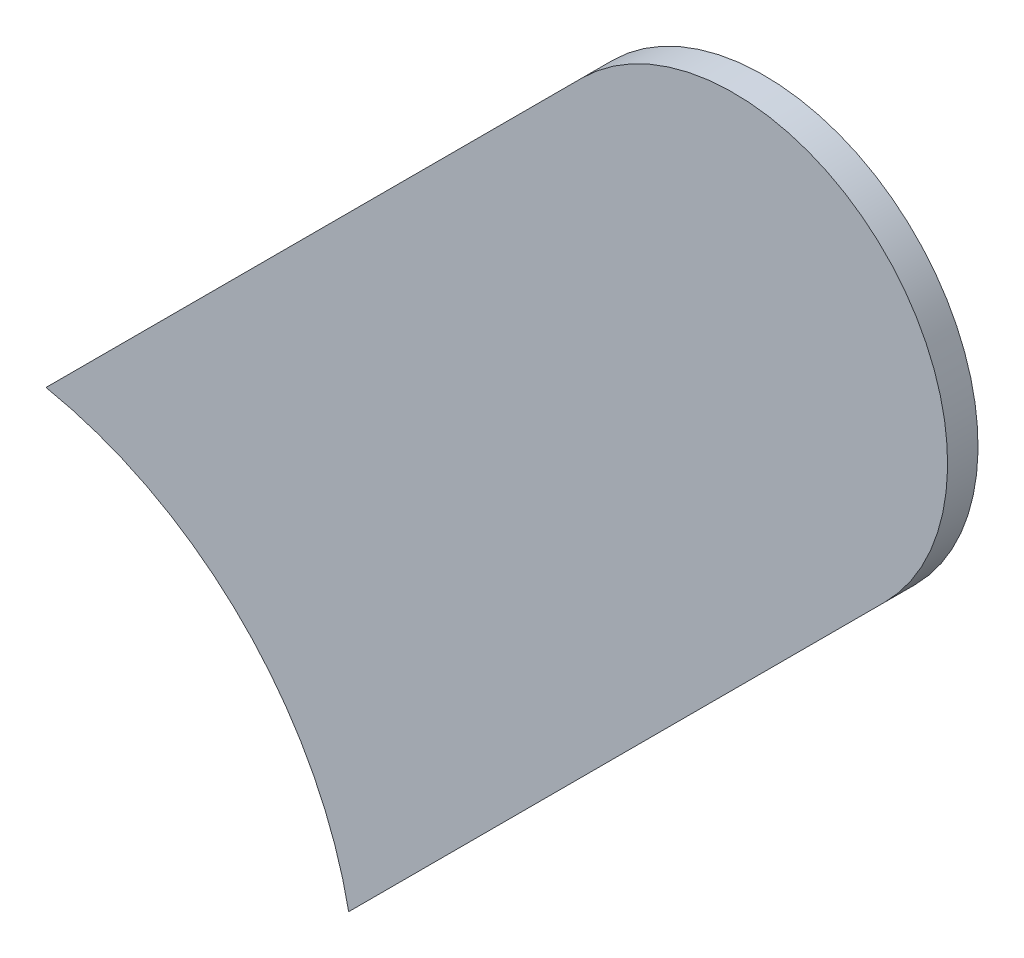
ISO-10303-21;
HEADER;
FILE_DESCRIPTION(('STEP AP214'),'2;1');
FILE_NAME('part.step','',(''),(''),'','','');
FILE_SCHEMA(('AUTOMOTIVE_DESIGN { 1 0 10303 214 1 1 1 1 }'));
ENDSEC;
DATA;
#1=APPLICATION_CONTEXT('core data for automotive mechanical design processes');
#2=APPLICATION_PROTOCOL_DEFINITION('international standard','automotive_design',2000,#1);
#3=PRODUCT_CONTEXT('',#1,'mechanical');
#4=PRODUCT('Part','Part','',(#3));
#5=PRODUCT_RELATED_PRODUCT_CATEGORY('part','',(#4));
#6=PRODUCT_DEFINITION_FORMATION('','',#4);
#7=PRODUCT_DEFINITION_CONTEXT('part definition',#1,'design');
#8=PRODUCT_DEFINITION('design','',#6,#7);
#9=PRODUCT_DEFINITION_SHAPE('','',#8);
#10=(LENGTH_UNIT() NAMED_UNIT(*) SI_UNIT(.MILLI.,.METRE.));
#11=(NAMED_UNIT(*) PLANE_ANGLE_UNIT() SI_UNIT($,.RADIAN.));
#12=(NAMED_UNIT(*) SI_UNIT($,.STERADIAN.) SOLID_ANGLE_UNIT());
#13=UNCERTAINTY_MEASURE_WITH_UNIT(LENGTH_MEASURE(1.E-05),#10,'distance_accuracy_value','');
#14=(GEOMETRIC_REPRESENTATION_CONTEXT(3) GLOBAL_UNCERTAINTY_ASSIGNED_CONTEXT((#13)) GLOBAL_UNIT_ASSIGNED_CONTEXT((#10,
#11,#12)) REPRESENTATION_CONTEXT('',''));
#15=CARTESIAN_POINT('',(0.,0.,0.));
#16=DIRECTION('',(0.,0.,1.));
#17=DIRECTION('',(1.,0.,0.));
#18=AXIS2_PLACEMENT_3D('',#15,#16,#17);
#19=CARTESIAN_POINT('',(90.8413733563948,90.5877949963948,0.));
#20=DIRECTION('',(-0.707106781186553,0.707106781186542,0.));
#21=DIRECTION('',(0.707106781186542,0.707106781186553,0.));
#22=AXIS2_PLACEMENT_3D('',#19,#20,#21);
#23=PLANE('',#22);
#24=DIRECTION('',(0.707106781186542,0.707106781186553,0.));
#25=VECTOR('',#24,1.);
#26=CARTESIAN_POINT('',(90.57679878,90.32322042,0.03556));
#27=LINE('',#26,#25);
#28=CARTESIAN_POINT('',(90.8413733563948,90.5877949963948,0.03556));
#29=VERTEX_POINT('',#28);
#30=CARTESIAN_POINT('',(91.46777998,91.21420162,0.03556));
#31=VERTEX_POINT('',#30);
#32=EDGE_CURVE('E11',#29,#31,#27,.T.);
#33=ORIENTED_EDGE('',*,*,#32,.F.);
#34=DIRECTION('',(0.,0.,1.));
#35=VECTOR('',#34,1.);
#36=CARTESIAN_POINT('',(90.8413733563948,90.5877949963948,0.));
#37=LINE('',#36,#35);
#38=CARTESIAN_POINT('',(90.8413733563948,90.5877949963948,0.));
#39=VERTEX_POINT('',#38);
#40=EDGE_CURVE('E24',#39,#29,#37,.T.);
#41=ORIENTED_EDGE('',*,*,#40,.F.);
#42=DIRECTION('',(0.707106781186542,0.707106781186553,0.));
#43=VECTOR('',#42,1.);
#44=CARTESIAN_POINT('',(90.57679878,90.32322042,0.));
#45=LINE('',#44,#43);
#46=CARTESIAN_POINT('',(91.46777998,91.21420162,0.));
#47=VERTEX_POINT('',#46);
#48=EDGE_CURVE('E75',#39,#47,#45,.T.);
#49=ORIENTED_EDGE('',*,*,#48,.T.);
#50=DIRECTION('',(0.,0.,1.));
#51=VECTOR('',#50,1.);
#52=CARTESIAN_POINT('',(91.46777998,91.21420162,0.));
#53=LINE('',#52,#51);
#54=EDGE_CURVE('E37',#47,#31,#53,.T.);
#55=ORIENTED_EDGE('',*,*,#54,.T.);
#56=EDGE_LOOP('',(#33,#41,#49,#55));
#57=FACE_BOUND('',#56,.T.);
#58=ADVANCED_FACE('F17',(#57),#23,.F.);
#59=CARTESIAN_POINT('',(91.2910036,91.390978,0.));
#60=DIRECTION('',(0.,0.,-1.));
#61=DIRECTION('',(0.707106781186548,-0.707106781186548,0.));
#62=AXIS2_PLACEMENT_3D('',#59,#60,#61);
#63=CYLINDRICAL_SURFACE('',#62,0.249999554103216);
#64=CARTESIAN_POINT('',(91.2910036,91.390978,0.03556));
#65=DIRECTION('',(0.,0.,1.));
#66=DIRECTION('',(0.707106781186548,-0.707106781186548,0.));
#67=AXIS2_PLACEMENT_3D('',#64,#65,#66);
#68=CIRCLE('',#67,0.249999554103216);
#69=CARTESIAN_POINT('',(91.11422722,91.56775438,0.03556));
#70=VERTEX_POINT('',#69);
#71=EDGE_CURVE('E83',#31,#70,#68,.T.);
#72=ORIENTED_EDGE('',*,*,#71,.F.);
#73=ORIENTED_EDGE('',*,*,#54,.F.);
#74=CARTESIAN_POINT('',(91.2910036,91.390978,0.));
#75=DIRECTION('',(0.,0.,1.));
#76=DIRECTION('',(0.707106781186548,-0.707106781186548,0.));
#77=AXIS2_PLACEMENT_3D('',#74,#75,#76);
#78=CIRCLE('',#77,0.249999554103216);
#79=CARTESIAN_POINT('',(91.11422722,91.56775438,0.));
#80=VERTEX_POINT('',#79);
#81=EDGE_CURVE('E81',#47,#80,#78,.T.);
#82=ORIENTED_EDGE('',*,*,#81,.T.);
#83=DIRECTION('',(0.,0.,1.));
#84=VECTOR('',#83,1.);
#85=CARTESIAN_POINT('',(91.11422722,91.56775438,0.));
#86=LINE('',#85,#84);
#87=EDGE_CURVE('E67',#80,#70,#86,.T.);
#88=ORIENTED_EDGE('',*,*,#87,.T.);
#89=EDGE_LOOP('',(#72,#73,#82,#88));
#90=FACE_BOUND('',#89,.T.);
#91=ADVANCED_FACE('F89',(#90),#63,.T.);
#92=CARTESIAN_POINT('',(91.11422722,91.56775438,0.));
#93=DIRECTION('',(0.707106781186542,-0.707106781186553,0.));
#94=DIRECTION('',(-0.707106781186553,-0.707106781186542,0.));
#95=AXIS2_PLACEMENT_3D('',#92,#93,#94);
#96=PLANE('',#95);
#97=DIRECTION('',(-0.707106781186553,-0.707106781186542,0.));
#98=VECTOR('',#97,1.);
#99=CARTESIAN_POINT('',(91.11422722,91.56775438,0.03556));
#100=LINE('',#99,#98);
#101=CARTESIAN_POINT('',(90.4878205963948,90.9413477563948,0.03556));
#102=VERTEX_POINT('',#101);
#103=EDGE_CURVE('E71',#70,#102,#100,.T.);
#104=ORIENTED_EDGE('',*,*,#103,.F.);
#105=ORIENTED_EDGE('',*,*,#87,.F.);
#106=DIRECTION('',(-0.707106781186553,-0.707106781186542,0.));
#107=VECTOR('',#106,1.);
#108=CARTESIAN_POINT('',(91.11422722,91.56775438,0.));
#109=LINE('',#108,#107);
#110=CARTESIAN_POINT('',(90.4878205963948,90.9413477563948,0.));
#111=VERTEX_POINT('',#110);
#112=EDGE_CURVE('E63',#80,#111,#109,.T.);
#113=ORIENTED_EDGE('',*,*,#112,.T.);
#114=DIRECTION('',(0.,0.,1.));
#115=VECTOR('',#114,1.);
#116=CARTESIAN_POINT('',(90.4878205963948,90.9413477563948,0.));
#117=LINE('',#116,#115);
#118=EDGE_CURVE('E53',#111,#102,#117,.T.);
#119=ORIENTED_EDGE('',*,*,#118,.T.);
#120=EDGE_LOOP('',(#104,#105,#113,#119));
#121=FACE_BOUND('',#120,.T.);
#122=ADVANCED_FACE('F66',(#121),#96,.F.);
#123=CARTESIAN_POINT('',(90.4000224,90.4999968,0.));
#124=DIRECTION('',(0.,0.,-1.));
#125=DIRECTION('',(1.,0.,0.));
#126=AXIS2_PLACEMENT_3D('',#123,#124,#125);
#127=CYLINDRICAL_SURFACE('',#126,0.4499991);
#128=ORIENTED_EDGE('',*,*,#40,.T.);
#129=CARTESIAN_POINT('',(90.4000224,90.4999968,0.03556));
#130=DIRECTION('',(0.,0.,1.));
#131=DIRECTION('',(1.,0.,0.));
#132=AXIS2_PLACEMENT_3D('',#129,#130,#131);
#133=CIRCLE('',#132,0.4499991);
#134=EDGE_CURVE('E59',#29,#102,#133,.T.);
#135=ORIENTED_EDGE('',*,*,#134,.T.);
#136=ORIENTED_EDGE('',*,*,#118,.F.);
#137=CARTESIAN_POINT('',(90.4000224,90.4999968,0.));
#138=DIRECTION('',(0.,0.,1.));
#139=DIRECTION('',(1.,0.,0.));
#140=AXIS2_PLACEMENT_3D('',#137,#138,#139);
#141=CIRCLE('',#140,0.4499991);
#142=EDGE_CURVE('E57',#39,#111,#141,.T.);
#143=ORIENTED_EDGE('',*,*,#142,.F.);
#144=EDGE_LOOP('',(#128,#135,#136,#143));
#145=FACE_BOUND('',#144,.T.);
#146=ADVANCED_FACE('F55',(#145),#127,.F.);
#147=CARTESIAN_POINT('',(90.57679878,90.32322042,0.));
#148=DIRECTION('',(0.,0.,-1.));
#149=DIRECTION('',(-1.,0.,0.));
#150=AXIS2_PLACEMENT_3D('',#147,#148,#149);
#151=PLANE('',#150);
#152=ORIENTED_EDGE('',*,*,#48,.F.);
#153=ORIENTED_EDGE('',*,*,#142,.T.);
#154=ORIENTED_EDGE('',*,*,#112,.F.);
#155=ORIENTED_EDGE('',*,*,#81,.F.);
#156=EDGE_LOOP('',(#152,#153,#154,#155));
#157=FACE_BOUND('',#156,.T.);
#158=ADVANCED_FACE('F74',(#157),#151,.T.);
#159=CARTESIAN_POINT('',(90.57679878,90.32322042,0.03556));
#160=DIRECTION('',(0.,0.,-1.));
#161=DIRECTION('',(-1.,0.,0.));
#162=AXIS2_PLACEMENT_3D('',#159,#160,#161);
#163=PLANE('',#162);
#164=ORIENTED_EDGE('',*,*,#134,.F.);
#165=ORIENTED_EDGE('',*,*,#32,.T.);
#166=ORIENTED_EDGE('',*,*,#71,.T.);
#167=ORIENTED_EDGE('',*,*,#103,.T.);
#168=EDGE_LOOP('',(#164,#165,#166,#167));
#169=FACE_BOUND('',#168,.T.);
#170=ADVANCED_FACE('F91',(#169),#163,.F.);
#171=CLOSED_SHELL('',(#58,#91,#122,#146,#158,#170));
#172=MANIFOLD_SOLID_BREP('B1',#171);
#173=ADVANCED_BREP_SHAPE_REPRESENTATION('',(#18,#172),#14);
#174=SHAPE_DEFINITION_REPRESENTATION(#9,#173);
ENDSEC;
END-ISO-10303-21;
